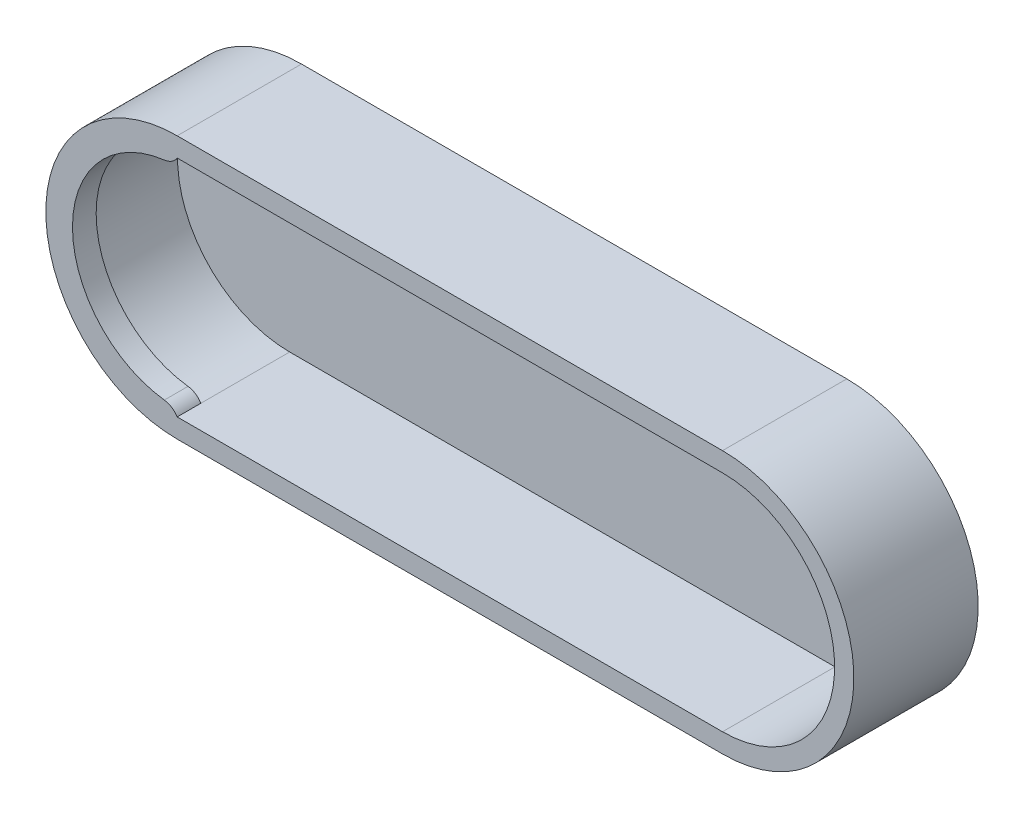
ISO-10303-21;
HEADER;
FILE_DESCRIPTION(('STEP AP214'),'2;1');
FILE_NAME('part.step','',(''),(''),'','','');
FILE_SCHEMA(('AUTOMOTIVE_DESIGN { 1 0 10303 214 1 1 1 1 }'));
ENDSEC;
DATA;
#1=APPLICATION_CONTEXT('core data for automotive mechanical design processes');
#2=APPLICATION_PROTOCOL_DEFINITION('international standard','automotive_design',2000,#1);
#3=PRODUCT_CONTEXT('',#1,'mechanical');
#4=PRODUCT('Part','Part','',(#3));
#5=PRODUCT_RELATED_PRODUCT_CATEGORY('part','',(#4));
#6=PRODUCT_DEFINITION_FORMATION('','',#4);
#7=PRODUCT_DEFINITION_CONTEXT('part definition',#1,'design');
#8=PRODUCT_DEFINITION('design','',#6,#7);
#9=PRODUCT_DEFINITION_SHAPE('','',#8);
#10=(LENGTH_UNIT() NAMED_UNIT(*) SI_UNIT(.MILLI.,.METRE.));
#11=(NAMED_UNIT(*) PLANE_ANGLE_UNIT() SI_UNIT($,.RADIAN.));
#12=(NAMED_UNIT(*) SI_UNIT($,.STERADIAN.) SOLID_ANGLE_UNIT());
#13=UNCERTAINTY_MEASURE_WITH_UNIT(LENGTH_MEASURE(1.E-05),#10,'distance_accuracy_value','');
#14=(GEOMETRIC_REPRESENTATION_CONTEXT(3) GLOBAL_UNCERTAINTY_ASSIGNED_CONTEXT((#13)) GLOBAL_UNIT_ASSIGNED_CONTEXT((#10,
#11,#12)) REPRESENTATION_CONTEXT('',''));
#15=CARTESIAN_POINT('',(0.,0.,0.));
#16=DIRECTION('',(0.,0.,1.));
#17=DIRECTION('',(1.,0.,0.));
#18=AXIS2_PLACEMENT_3D('',#15,#16,#17);
#19=CARTESIAN_POINT('',(46.06,0.,2.));
#20=DIRECTION('',(0.,0.,-1.));
#21=DIRECTION('',(-1.,0.,0.));
#22=AXIS2_PLACEMENT_3D('',#19,#20,#21);
#23=CYLINDRICAL_SURFACE('',#22,18.94);
#24=CARTESIAN_POINT('',(46.06,0.,0.));
#25=DIRECTION('',(0.,0.,-1.));
#26=DIRECTION('',(-1.,0.,0.));
#27=AXIS2_PLACEMENT_3D('',#24,#25,#26);
#28=CIRCLE('',#27,18.94);
#29=CARTESIAN_POINT('',(46.06,18.94,0.));
#30=VERTEX_POINT('',#29);
#31=CARTESIAN_POINT('',(46.06,-18.94,0.));
#32=VERTEX_POINT('',#31);
#33=EDGE_CURVE('E108',#30,#32,#28,.T.);
#34=ORIENTED_EDGE('',*,*,#33,.F.);
#35=DIRECTION('',(0.,0.,-1.));
#36=VECTOR('',#35,1.);
#37=CARTESIAN_POINT('',(46.06,18.94,2.));
#38=LINE('',#37,#36);
#39=CARTESIAN_POINT('',(46.06,18.94,2.));
#40=VERTEX_POINT('',#39);
#41=EDGE_CURVE('E12',#40,#30,#38,.T.);
#42=ORIENTED_EDGE('',*,*,#41,.F.);
#43=CARTESIAN_POINT('',(46.06,0.,2.));
#44=DIRECTION('',(0.,0.,-1.));
#45=DIRECTION('',(-1.,0.,0.));
#46=AXIS2_PLACEMENT_3D('',#43,#44,#45);
#47=CIRCLE('',#46,18.94);
#48=CARTESIAN_POINT('',(46.06,-18.94,2.));
#49=VERTEX_POINT('',#48);
#50=EDGE_CURVE('E102',#40,#49,#47,.T.);
#51=ORIENTED_EDGE('',*,*,#50,.T.);
#52=DIRECTION('',(0.,0.,-1.));
#53=VECTOR('',#52,1.);
#54=CARTESIAN_POINT('',(46.06,-18.94,2.));
#55=LINE('',#54,#53);
#56=EDGE_CURVE('E47',#49,#32,#55,.T.);
#57=ORIENTED_EDGE('',*,*,#56,.T.);
#58=EDGE_LOOP('',(#34,#42,#51,#57));
#59=FACE_BOUND('',#58,.T.);
#60=ADVANCED_FACE('F44',(#59),#23,.T.);
#61=CARTESIAN_POINT('',(46.06,18.94,2.));
#62=DIRECTION('',(0.,1.,0.));
#63=DIRECTION('',(-1.,0.,0.));
#64=AXIS2_PLACEMENT_3D('',#61,#62,#63);
#65=PLANE('',#64);
#66=DIRECTION('',(1.,0.,0.));
#67=VECTOR('',#66,1.);
#68=CARTESIAN_POINT('',(46.06,18.94,0.));
#69=LINE('',#68,#67);
#70=CARTESIAN_POINT('',(-46.06,18.94,0.));
#71=VERTEX_POINT('',#70);
#72=EDGE_CURVE('E104',#71,#30,#69,.T.);
#73=ORIENTED_EDGE('',*,*,#72,.F.);
#74=DIRECTION('',(0.,0.,-1.));
#75=VECTOR('',#74,1.);
#76=CARTESIAN_POINT('',(-46.06,18.94,2.));
#77=LINE('',#76,#75);
#78=CARTESIAN_POINT('',(-46.06,18.94,2.));
#79=VERTEX_POINT('',#78);
#80=EDGE_CURVE('E53',#79,#71,#77,.T.);
#81=ORIENTED_EDGE('',*,*,#80,.F.);
#82=DIRECTION('',(1.,0.,0.));
#83=VECTOR('',#82,1.);
#84=CARTESIAN_POINT('',(46.06,18.94,2.));
#85=LINE('',#84,#83);
#86=EDGE_CURVE('E99',#79,#40,#85,.T.);
#87=ORIENTED_EDGE('',*,*,#86,.T.);
#88=ORIENTED_EDGE('',*,*,#41,.T.);
#89=EDGE_LOOP('',(#73,#81,#87,#88));
#90=FACE_BOUND('',#89,.T.);
#91=ADVANCED_FACE('F118',(#90),#65,.T.);
#92=CARTESIAN_POINT('',(-46.06,0.,2.));
#93=DIRECTION('',(0.,0.,-1.));
#94=DIRECTION('',(-1.,0.,0.));
#95=AXIS2_PLACEMENT_3D('',#92,#93,#94);
#96=CYLINDRICAL_SURFACE('',#95,18.94);
#97=CARTESIAN_POINT('',(-46.06,0.,0.));
#98=DIRECTION('',(0.,0.,-1.));
#99=DIRECTION('',(1.,0.,0.));
#100=AXIS2_PLACEMENT_3D('',#97,#98,#99);
#101=CIRCLE('',#100,18.94);
#102=CARTESIAN_POINT('',(-46.0600000000001,-18.94,0.));
#103=VERTEX_POINT('',#102);
#104=EDGE_CURVE('E94',#103,#71,#101,.T.);
#105=ORIENTED_EDGE('',*,*,#104,.F.);
#106=DIRECTION('',(0.,0.,-1.));
#107=VECTOR('',#106,1.);
#108=CARTESIAN_POINT('',(-46.0600000000001,-18.94,2.));
#109=LINE('',#108,#107);
#110=CARTESIAN_POINT('',(-46.0600000000001,-18.94,2.));
#111=VERTEX_POINT('',#110);
#112=EDGE_CURVE('E89',#111,#103,#109,.T.);
#113=ORIENTED_EDGE('',*,*,#112,.F.);
#114=CARTESIAN_POINT('',(-46.06,0.,2.));
#115=DIRECTION('',(0.,0.,-1.));
#116=DIRECTION('',(1.,0.,0.));
#117=AXIS2_PLACEMENT_3D('',#114,#115,#116);
#118=CIRCLE('',#117,18.94);
#119=EDGE_CURVE('E92',#111,#79,#118,.T.);
#120=ORIENTED_EDGE('',*,*,#119,.T.);
#121=ORIENTED_EDGE('',*,*,#80,.T.);
#122=EDGE_LOOP('',(#105,#113,#120,#121));
#123=FACE_BOUND('',#122,.T.);
#124=ADVANCED_FACE('F91',(#123),#96,.T.);
#125=CARTESIAN_POINT('',(-46.0600000000001,-18.94,2.));
#126=DIRECTION('',(0.,-1.,0.));
#127=DIRECTION('',(1.,0.,0.));
#128=AXIS2_PLACEMENT_3D('',#125,#126,#127);
#129=PLANE('',#128);
#130=DIRECTION('',(-1.,0.,0.));
#131=VECTOR('',#130,1.);
#132=CARTESIAN_POINT('',(-46.0600000000001,-18.94,0.));
#133=LINE('',#132,#131);
#134=EDGE_CURVE('E111',#32,#103,#133,.T.);
#135=ORIENTED_EDGE('',*,*,#134,.F.);
#136=ORIENTED_EDGE('',*,*,#56,.F.);
#137=DIRECTION('',(-1.,0.,0.));
#138=VECTOR('',#137,1.);
#139=CARTESIAN_POINT('',(-46.0600000000001,-18.94,2.));
#140=LINE('',#139,#138);
#141=EDGE_CURVE('E98',#49,#111,#140,.T.);
#142=ORIENTED_EDGE('',*,*,#141,.T.);
#143=ORIENTED_EDGE('',*,*,#112,.T.);
#144=EDGE_LOOP('',(#135,#136,#142,#143));
#145=FACE_BOUND('',#144,.T.);
#146=ADVANCED_FACE('F101',(#145),#129,.T.);
#147=CARTESIAN_POINT('',(46.06,0.,2.));
#148=DIRECTION('',(0.,0.,-1.));
#149=DIRECTION('',(-1.,0.,0.));
#150=AXIS2_PLACEMENT_3D('',#147,#148,#149);
#151=PLANE('',#150);
#152=ORIENTED_EDGE('',*,*,#50,.F.);
#153=ORIENTED_EDGE('',*,*,#86,.F.);
#154=ORIENTED_EDGE('',*,*,#119,.F.);
#155=ORIENTED_EDGE('',*,*,#141,.F.);
#156=EDGE_LOOP('',(#152,#153,#154,#155));
#157=FACE_BOUND('',#156,.T.);
#158=ADVANCED_FACE('F97',(#157),#151,.F.);
#159=CARTESIAN_POINT('',(46.06,0.,0.));
#160=DIRECTION('',(0.,0.,-1.));
#161=DIRECTION('',(-1.,0.,0.));
#162=AXIS2_PLACEMENT_3D('',#159,#160,#161);
#163=PLANE('',#162);
#164=ORIENTED_EDGE('',*,*,#33,.T.);
#165=ORIENTED_EDGE('',*,*,#134,.T.);
#166=ORIENTED_EDGE('',*,*,#104,.T.);
#167=ORIENTED_EDGE('',*,*,#72,.T.);
#168=EDGE_LOOP('',(#164,#165,#166,#167));
#169=FACE_BOUND('',#168,.T.);
#170=ADVANCED_FACE('F117',(#169),#163,.T.);
#171=CLOSED_SHELL('',(#60,#91,#124,#146,#158,#170));
#172=MANIFOLD_SOLID_BREP('B2',#171);
#173=CARTESIAN_POINT('',(-46.06,0.,21.));
#174=DIRECTION('',(0.,0.,-1.));
#175=DIRECTION('',(-1.,0.,0.));
#176=AXIS2_PLACEMENT_3D('',#173,#174,#175);
#177=CYLINDRICAL_SURFACE('',#176,18.94);
#178=DIRECTION('',(0.,0.,-1.));
#179=VECTOR('',#178,1.);
#180=CARTESIAN_POINT('',(-46.06,18.94,21.));
#181=LINE('',#180,#179);
#182=CARTESIAN_POINT('',(-46.06,18.94,17.));
#183=VERTEX_POINT('',#182);
#184=CARTESIAN_POINT('',(-46.06,18.94,0.));
#185=VERTEX_POINT('',#184);
#186=EDGE_CURVE('E271',#183,#185,#181,.T.);
#187=ORIENTED_EDGE('',*,*,#186,.F.);
#188=CARTESIAN_POINT('',(-46.06,0.,17.));
#189=DIRECTION('',(0.,0.,1.));
#190=DIRECTION('',(1.,0.,0.));
#191=AXIS2_PLACEMENT_3D('',#188,#189,#190);
#192=CIRCLE('',#191,18.94);
#193=CARTESIAN_POINT('',(-46.0599999999998,-18.94,17.));
#194=VERTEX_POINT('',#193);
#195=EDGE_CURVE('E251',#183,#194,#192,.T.);
#196=ORIENTED_EDGE('',*,*,#195,.T.);
#197=DIRECTION('',(0.,0.,-1.));
#198=VECTOR('',#197,1.);
#199=CARTESIAN_POINT('',(-46.0600000000001,-18.94,21.));
#200=LINE('',#199,#198);
#201=CARTESIAN_POINT('',(-46.0600000000001,-18.94,0.));
#202=VERTEX_POINT('',#201);
#203=EDGE_CURVE('E259',#194,#202,#200,.T.);
#204=ORIENTED_EDGE('',*,*,#203,.T.);
#205=CARTESIAN_POINT('',(-46.06,0.,0.));
#206=DIRECTION('',(0.,0.,1.));
#207=DIRECTION('',(1.,0.,0.));
#208=AXIS2_PLACEMENT_3D('',#205,#206,#207);
#209=CIRCLE('',#208,18.94);
#210=EDGE_CURVE('E348',#185,#202,#209,.T.);
#211=ORIENTED_EDGE('',*,*,#210,.F.);
#212=EDGE_LOOP('',(#187,#196,#204,#211));
#213=FACE_BOUND('',#212,.T.);
#214=ADVANCED_FACE('F167',(#213),#177,.F.);
#215=CARTESIAN_POINT('',(-46.06,0.,21.));
#216=DIRECTION('',(0.,0.,1.));
#217=DIRECTION('',(1.,0.,0.));
#218=AXIS2_PLACEMENT_3D('',#215,#216,#217);
#219=PLANE('',#218);
#220=CARTESIAN_POINT('',(-46.06,0.,21.));
#221=DIRECTION('',(0.,0.,1.));
#222=DIRECTION('',(1.,0.,0.));
#223=AXIS2_PLACEMENT_3D('',#220,#221,#222);
#224=CIRCLE('',#223,22.19);
#225=CARTESIAN_POINT('',(-46.06,22.19,21.));
#226=VERTEX_POINT('',#225);
#227=CARTESIAN_POINT('',(-46.06,-22.19,21.));
#228=VERTEX_POINT('',#227);
#229=EDGE_CURVE('E285',#226,#228,#224,.T.);
#230=ORIENTED_EDGE('',*,*,#229,.T.);
#231=DIRECTION('',(1.,0.,0.));
#232=VECTOR('',#231,1.);
#233=CARTESIAN_POINT('',(-46.06,-22.19,21.));
#234=LINE('',#233,#232);
#235=CARTESIAN_POINT('',(46.0600000000001,-22.19,21.));
#236=VERTEX_POINT('',#235);
#237=EDGE_CURVE('E288',#228,#236,#234,.T.);
#238=ORIENTED_EDGE('',*,*,#237,.T.);
#239=CARTESIAN_POINT('',(46.06,0.,21.));
#240=DIRECTION('',(0.,0.,1.));
#241=DIRECTION('',(-1.,0.,0.));
#242=AXIS2_PLACEMENT_3D('',#239,#240,#241);
#243=CIRCLE('',#242,22.19);
#244=CARTESIAN_POINT('',(46.06,22.19,21.));
#245=VERTEX_POINT('',#244);
#246=EDGE_CURVE('E291',#236,#245,#243,.T.);
#247=ORIENTED_EDGE('',*,*,#246,.T.);
#248=DIRECTION('',(-1.,0.,0.));
#249=VECTOR('',#248,1.);
#250=CARTESIAN_POINT('',(-46.06,22.19,21.));
#251=LINE('',#250,#249);
#252=EDGE_CURVE('E293',#245,#226,#251,.T.);
#253=ORIENTED_EDGE('',*,*,#252,.T.);
#254=EDGE_LOOP('',(#230,#238,#247,#253));
#255=FACE_BOUND('',#254,.T.);
#256=CARTESIAN_POINT('',(-46.06,0.,21.));
#257=DIRECTION('',(0.,0.,-1.));
#258=DIRECTION('',(1.,0.,0.));
#259=AXIS2_PLACEMENT_3D('',#256,#257,#258);
#260=CIRCLE('',#259,17.69);
#261=CARTESIAN_POINT('',(-48.2333782115873,-17.5559826597487,21.));
#262=VERTEX_POINT('',#261);
#263=CARTESIAN_POINT('',(-48.2333782115875,17.5559826597487,21.));
#264=VERTEX_POINT('',#263);
#265=EDGE_CURVE('E273',#262,#264,#260,.T.);
#266=ORIENTED_EDGE('',*,*,#265,.T.);
#267=CARTESIAN_POINT('',(-48.6019556358251,20.5332550158395,21.));
#268=DIRECTION('',(0.,0.,1.));
#269=DIRECTION('',(1.,0.,0.));
#270=AXIS2_PLACEMENT_3D('',#267,#268,#269);
#271=CIRCLE('',#270,3.);
#272=CARTESIAN_POINT('',(-46.06,18.94,21.));
#273=VERTEX_POINT('',#272);
#274=EDGE_CURVE('E255',#264,#273,#271,.T.);
#275=ORIENTED_EDGE('',*,*,#274,.T.);
#276=DIRECTION('',(-1.,0.,0.));
#277=VECTOR('',#276,1.);
#278=CARTESIAN_POINT('',(-46.06,18.94,21.));
#279=LINE('',#278,#277);
#280=CARTESIAN_POINT('',(46.06,18.94,21.));
#281=VERTEX_POINT('',#280);
#282=EDGE_CURVE('E325',#281,#273,#279,.T.);
#283=ORIENTED_EDGE('',*,*,#282,.F.);
#284=CARTESIAN_POINT('',(46.06,0.,21.));
#285=DIRECTION('',(0.,0.,1.));
#286=DIRECTION('',(-1.,0.,0.));
#287=AXIS2_PLACEMENT_3D('',#284,#285,#286);
#288=CIRCLE('',#287,18.94);
#289=CARTESIAN_POINT('',(46.06,-18.94,21.));
#290=VERTEX_POINT('',#289);
#291=EDGE_CURVE('E333',#290,#281,#288,.T.);
#292=ORIENTED_EDGE('',*,*,#291,.F.);
#293=DIRECTION('',(1.,0.,0.));
#294=VECTOR('',#293,1.);
#295=CARTESIAN_POINT('',(-46.06,-18.94,21.));
#296=LINE('',#295,#294);
#297=CARTESIAN_POINT('',(-46.0600000000001,-18.94,21.));
#298=VERTEX_POINT('',#297);
#299=EDGE_CURVE('E332',#298,#290,#296,.T.);
#300=ORIENTED_EDGE('',*,*,#299,.F.);
#301=CARTESIAN_POINT('',(-48.6019556358248,-20.5332550158395,21.));
#302=DIRECTION('',(0.,0.,1.));
#303=DIRECTION('',(1.,0.,0.));
#304=AXIS2_PLACEMENT_3D('',#301,#302,#303);
#305=CIRCLE('',#304,3.);
#306=EDGE_CURVE('E275',#298,#262,#305,.T.);
#307=ORIENTED_EDGE('',*,*,#306,.T.);
#308=EDGE_LOOP('',(#266,#275,#283,#292,#300,#307));
#309=FACE_BOUND('',#308,.T.);
#310=ADVANCED_FACE('F323',(#255,#309),#219,.T.);
#311=CARTESIAN_POINT('',(-46.06,0.,0.));
#312=DIRECTION('',(0.,0.,1.));
#313=DIRECTION('',(1.,0.,0.));
#314=AXIS2_PLACEMENT_3D('',#311,#312,#313);
#315=PLANE('',#314);
#316=CARTESIAN_POINT('',(-46.06,0.,0.));
#317=DIRECTION('',(0.,0.,1.));
#318=DIRECTION('',(1.,0.,0.));
#319=AXIS2_PLACEMENT_3D('',#316,#317,#318);
#320=CIRCLE('',#319,22.19);
#321=CARTESIAN_POINT('',(-46.06,22.19,0.));
#322=VERTEX_POINT('',#321);
#323=CARTESIAN_POINT('',(-46.06,-22.19,0.));
#324=VERTEX_POINT('',#323);
#325=EDGE_CURVE('E284',#322,#324,#320,.T.);
#326=ORIENTED_EDGE('',*,*,#325,.F.);
#327=DIRECTION('',(-1.,0.,0.));
#328=VECTOR('',#327,1.);
#329=CARTESIAN_POINT('',(-46.06,22.19,0.));
#330=LINE('',#329,#328);
#331=CARTESIAN_POINT('',(46.06,22.19,0.));
#332=VERTEX_POINT('',#331);
#333=EDGE_CURVE('E289',#332,#322,#330,.T.);
#334=ORIENTED_EDGE('',*,*,#333,.F.);
#335=CARTESIAN_POINT('',(46.06,0.,0.));
#336=DIRECTION('',(0.,0.,1.));
#337=DIRECTION('',(-1.,0.,0.));
#338=AXIS2_PLACEMENT_3D('',#335,#336,#337);
#339=CIRCLE('',#338,22.19);
#340=CARTESIAN_POINT('',(46.0600000000001,-22.19,0.));
#341=VERTEX_POINT('',#340);
#342=EDGE_CURVE('E300',#341,#332,#339,.T.);
#343=ORIENTED_EDGE('',*,*,#342,.F.);
#344=DIRECTION('',(1.,0.,0.));
#345=VECTOR('',#344,1.);
#346=CARTESIAN_POINT('',(-46.06,-22.19,0.));
#347=LINE('',#346,#345);
#348=EDGE_CURVE('E298',#324,#341,#347,.T.);
#349=ORIENTED_EDGE('',*,*,#348,.F.);
#350=EDGE_LOOP('',(#326,#334,#343,#349));
#351=FACE_BOUND('',#350,.T.);
#352=CARTESIAN_POINT('',(46.06,0.,0.));
#353=DIRECTION('',(0.,0.,1.));
#354=DIRECTION('',(-1.,0.,0.));
#355=AXIS2_PLACEMENT_3D('',#352,#353,#354);
#356=CIRCLE('',#355,18.94);
#357=CARTESIAN_POINT('',(46.06,-18.94,0.));
#358=VERTEX_POINT('',#357);
#359=CARTESIAN_POINT('',(46.06,18.94,0.));
#360=VERTEX_POINT('',#359);
#361=EDGE_CURVE('E337',#358,#360,#356,.T.);
#362=ORIENTED_EDGE('',*,*,#361,.T.);
#363=DIRECTION('',(-1.,0.,0.));
#364=VECTOR('',#363,1.);
#365=CARTESIAN_POINT('',(-46.06,18.94,0.));
#366=LINE('',#365,#364);
#367=EDGE_CURVE('E340',#360,#185,#366,.T.);
#368=ORIENTED_EDGE('',*,*,#367,.T.);
#369=ORIENTED_EDGE('',*,*,#210,.T.);
#370=DIRECTION('',(1.,0.,0.));
#371=VECTOR('',#370,1.);
#372=CARTESIAN_POINT('',(-46.06,-18.94,0.));
#373=LINE('',#372,#371);
#374=EDGE_CURVE('E265',#202,#358,#373,.T.);
#375=ORIENTED_EDGE('',*,*,#374,.T.);
#376=EDGE_LOOP('',(#362,#368,#369,#375));
#377=FACE_BOUND('',#376,.T.);
#378=ADVANCED_FACE('F350',(#351,#377),#315,.F.);
#379=CARTESIAN_POINT('',(-46.06,0.,21.));
#380=DIRECTION('',(0.,0.,-1.));
#381=DIRECTION('',(-1.,0.,0.));
#382=AXIS2_PLACEMENT_3D('',#379,#380,#381);
#383=CYLINDRICAL_SURFACE('',#382,22.19);
#384=ORIENTED_EDGE('',*,*,#325,.T.);
#385=DIRECTION('',(0.,0.,-1.));
#386=VECTOR('',#385,1.);
#387=CARTESIAN_POINT('',(-46.06,-22.19,21.));
#388=LINE('',#387,#386);
#389=EDGE_CURVE('E311',#228,#324,#388,.T.);
#390=ORIENTED_EDGE('',*,*,#389,.F.);
#391=ORIENTED_EDGE('',*,*,#229,.F.);
#392=DIRECTION('',(0.,0.,-1.));
#393=VECTOR('',#392,1.);
#394=CARTESIAN_POINT('',(-46.06,22.19,21.));
#395=LINE('',#394,#393);
#396=EDGE_CURVE('E295',#226,#322,#395,.T.);
#397=ORIENTED_EDGE('',*,*,#396,.T.);
#398=EDGE_LOOP('',(#384,#390,#391,#397));
#399=FACE_BOUND('',#398,.T.);
#400=ADVANCED_FACE('F386',(#399),#383,.T.);
#401=CARTESIAN_POINT('',(-46.06,-22.19,21.));
#402=DIRECTION('',(0.,1.,0.));
#403=DIRECTION('',(-1.,0.,0.));
#404=AXIS2_PLACEMENT_3D('',#401,#402,#403);
#405=PLANE('',#404);
#406=ORIENTED_EDGE('',*,*,#348,.T.);
#407=DIRECTION('',(0.,0.,-1.));
#408=VECTOR('',#407,1.);
#409=CARTESIAN_POINT('',(46.0600000000001,-22.19,21.));
#410=LINE('',#409,#408);
#411=EDGE_CURVE('E308',#236,#341,#410,.T.);
#412=ORIENTED_EDGE('',*,*,#411,.F.);
#413=ORIENTED_EDGE('',*,*,#237,.F.);
#414=ORIENTED_EDGE('',*,*,#389,.T.);
#415=EDGE_LOOP('',(#406,#412,#413,#414));
#416=FACE_BOUND('',#415,.T.);
#417=ADVANCED_FACE('F389',(#416),#405,.F.);
#418=CARTESIAN_POINT('',(46.06,0.,21.));
#419=DIRECTION('',(0.,0.,-1.));
#420=DIRECTION('',(-1.,0.,0.));
#421=AXIS2_PLACEMENT_3D('',#418,#419,#420);
#422=CYLINDRICAL_SURFACE('',#421,22.19);
#423=ORIENTED_EDGE('',*,*,#342,.T.);
#424=DIRECTION('',(0.,0.,-1.));
#425=VECTOR('',#424,1.);
#426=CARTESIAN_POINT('',(46.06,22.19,21.));
#427=LINE('',#426,#425);
#428=EDGE_CURVE('E305',#245,#332,#427,.T.);
#429=ORIENTED_EDGE('',*,*,#428,.F.);
#430=ORIENTED_EDGE('',*,*,#246,.F.);
#431=ORIENTED_EDGE('',*,*,#411,.T.);
#432=EDGE_LOOP('',(#423,#429,#430,#431));
#433=FACE_BOUND('',#432,.T.);
#434=ADVANCED_FACE('F363',(#433),#422,.T.);
#435=CARTESIAN_POINT('',(-46.06,22.19,21.));
#436=DIRECTION('',(0.,-1.,0.));
#437=DIRECTION('',(0.,0.,-1.));
#438=AXIS2_PLACEMENT_3D('',#435,#436,#437);
#439=PLANE('',#438);
#440=ORIENTED_EDGE('',*,*,#333,.T.);
#441=ORIENTED_EDGE('',*,*,#396,.F.);
#442=ORIENTED_EDGE('',*,*,#252,.F.);
#443=ORIENTED_EDGE('',*,*,#428,.T.);
#444=EDGE_LOOP('',(#440,#441,#442,#443));
#445=FACE_BOUND('',#444,.T.);
#446=ADVANCED_FACE('F355',(#445),#439,.F.);
#447=CARTESIAN_POINT('',(46.06,0.,21.));
#448=DIRECTION('',(0.,0.,-1.));
#449=DIRECTION('',(-1.,0.,0.));
#450=AXIS2_PLACEMENT_3D('',#447,#448,#449);
#451=CYLINDRICAL_SURFACE('',#450,18.94);
#452=ORIENTED_EDGE('',*,*,#361,.F.);
#453=DIRECTION('',(0.,0.,-1.));
#454=VECTOR('',#453,1.);
#455=CARTESIAN_POINT('',(46.06,-18.94,21.));
#456=LINE('',#455,#454);
#457=EDGE_CURVE('E269',#290,#358,#456,.T.);
#458=ORIENTED_EDGE('',*,*,#457,.F.);
#459=ORIENTED_EDGE('',*,*,#291,.T.);
#460=DIRECTION('',(0.,0.,-1.));
#461=VECTOR('',#460,1.);
#462=CARTESIAN_POINT('',(46.06,18.94,21.));
#463=LINE('',#462,#461);
#464=EDGE_CURVE('E281',#281,#360,#463,.T.);
#465=ORIENTED_EDGE('',*,*,#464,.T.);
#466=EDGE_LOOP('',(#452,#458,#459,#465));
#467=FACE_BOUND('',#466,.T.);
#468=ADVANCED_FACE('F352',(#467),#451,.F.);
#469=CARTESIAN_POINT('',(-46.06,18.94,21.));
#470=DIRECTION('',(0.,-1.,0.));
#471=DIRECTION('',(1.,0.,0.));
#472=AXIS2_PLACEMENT_3D('',#469,#470,#471);
#473=PLANE('',#472);
#474=ORIENTED_EDGE('',*,*,#367,.F.);
#475=ORIENTED_EDGE('',*,*,#464,.F.);
#476=ORIENTED_EDGE('',*,*,#282,.T.);
#477=EDGE_CURVE('E276',#273,#183,#181,.T.);
#478=ORIENTED_EDGE('',*,*,#477,.T.);
#479=ORIENTED_EDGE('',*,*,#186,.T.);
#480=EDGE_LOOP('',(#474,#475,#476,#478,#479));
#481=FACE_BOUND('',#480,.T.);
#482=ADVANCED_FACE('F331',(#481),#473,.T.);
#483=CARTESIAN_POINT('',(-46.06,-18.94,21.));
#484=DIRECTION('',(0.,1.,0.));
#485=DIRECTION('',(-1.,0.,0.));
#486=AXIS2_PLACEMENT_3D('',#483,#484,#485);
#487=PLANE('',#486);
#488=ORIENTED_EDGE('',*,*,#374,.F.);
#489=ORIENTED_EDGE('',*,*,#203,.F.);
#490=EDGE_CURVE('E261',#298,#194,#200,.T.);
#491=ORIENTED_EDGE('',*,*,#490,.F.);
#492=ORIENTED_EDGE('',*,*,#299,.T.);
#493=ORIENTED_EDGE('',*,*,#457,.T.);
#494=EDGE_LOOP('',(#488,#489,#491,#492,#493));
#495=FACE_BOUND('',#494,.T.);
#496=ADVANCED_FACE('F260',(#495),#487,.T.);
#497=CARTESIAN_POINT('',(-46.06,0.,17.));
#498=DIRECTION('',(0.,0.,1.));
#499=DIRECTION('',(1.,0.,0.));
#500=AXIS2_PLACEMENT_3D('',#497,#498,#499);
#501=CYLINDRICAL_SURFACE('',#500,17.69);
#502=CARTESIAN_POINT('',(-46.06,0.,17.));
#503=DIRECTION('',(0.,0.,-1.));
#504=DIRECTION('',(1.,0.,0.));
#505=AXIS2_PLACEMENT_3D('',#502,#503,#504);
#506=CIRCLE('',#505,17.69);
#507=CARTESIAN_POINT('',(-48.2333782115873,-17.5559826597487,17.));
#508=VERTEX_POINT('',#507);
#509=CARTESIAN_POINT('',(-48.2333782115875,17.5559826597487,17.));
#510=VERTEX_POINT('',#509);
#511=EDGE_CURVE('E252',#508,#510,#506,.T.);
#512=ORIENTED_EDGE('',*,*,#511,.T.);
#513=DIRECTION('',(0.,0.,1.));
#514=VECTOR('',#513,1.);
#515=CARTESIAN_POINT('',(-48.2333782115875,17.5559826597487,17.));
#516=LINE('',#515,#514);
#517=EDGE_CURVE('E315',#510,#264,#516,.T.);
#518=ORIENTED_EDGE('',*,*,#517,.T.);
#519=ORIENTED_EDGE('',*,*,#265,.F.);
#520=DIRECTION('',(0.,0.,1.));
#521=VECTOR('',#520,1.);
#522=CARTESIAN_POINT('',(-48.2333782115873,-17.5559826597487,17.));
#523=LINE('',#522,#521);
#524=EDGE_CURVE('E187',#262,#508,#523,.F.);
#525=ORIENTED_EDGE('',*,*,#524,.T.);
#526=EDGE_LOOP('',(#512,#518,#519,#525));
#527=FACE_BOUND('',#526,.T.);
#528=ADVANCED_FACE('F336',(#527),#501,.F.);
#529=CARTESIAN_POINT('',(-46.06,0.,17.));
#530=DIRECTION('',(0.,0.,1.));
#531=DIRECTION('',(1.,0.,0.));
#532=AXIS2_PLACEMENT_3D('',#529,#530,#531);
#533=PLANE('',#532);
#534=ORIENTED_EDGE('',*,*,#195,.F.);
#535=CARTESIAN_POINT('',(-48.6019556358251,20.5332550158395,17.));
#536=DIRECTION('',(0.,0.,1.));
#537=DIRECTION('',(1.,0.,0.));
#538=AXIS2_PLACEMENT_3D('',#535,#536,#537);
#539=CIRCLE('',#538,3.);
#540=EDGE_CURVE('E42',#183,#510,#539,.F.);
#541=ORIENTED_EDGE('',*,*,#540,.T.);
#542=ORIENTED_EDGE('',*,*,#511,.F.);
#543=CARTESIAN_POINT('',(-48.6019556358248,-20.5332550158395,17.));
#544=DIRECTION('',(0.,0.,1.));
#545=DIRECTION('',(1.,0.,0.));
#546=AXIS2_PLACEMENT_3D('',#543,#544,#545);
#547=CIRCLE('',#546,3.);
#548=EDGE_CURVE('E175',#508,#194,#547,.F.);
#549=ORIENTED_EDGE('',*,*,#548,.T.);
#550=EDGE_LOOP('',(#534,#541,#542,#549));
#551=FACE_BOUND('',#550,.T.);
#552=ADVANCED_FACE('F249',(#551),#533,.F.);
#553=CARTESIAN_POINT('',(-48.6019556358251,20.5332550158395,17.));
#554=DIRECTION('',(0.,0.,1.));
#555=DIRECTION('',(1.,0.,0.));
#556=AXIS2_PLACEMENT_3D('',#553,#554,#555);
#557=CYLINDRICAL_SURFACE('',#556,3.);
#558=ORIENTED_EDGE('',*,*,#540,.F.);
#559=ORIENTED_EDGE('',*,*,#477,.F.);
#560=ORIENTED_EDGE('',*,*,#274,.F.);
#561=ORIENTED_EDGE('',*,*,#517,.F.);
#562=EDGE_LOOP('',(#558,#559,#560,#561));
#563=FACE_BOUND('',#562,.T.);
#564=ADVANCED_FACE('F335',(#563),#557,.T.);
#565=CARTESIAN_POINT('',(-48.6019556358248,-20.5332550158395,17.));
#566=DIRECTION('',(0.,0.,1.));
#567=DIRECTION('',(1.,0.,0.));
#568=AXIS2_PLACEMENT_3D('',#565,#566,#567);
#569=CYLINDRICAL_SURFACE('',#568,3.);
#570=ORIENTED_EDGE('',*,*,#548,.F.);
#571=ORIENTED_EDGE('',*,*,#524,.F.);
#572=ORIENTED_EDGE('',*,*,#306,.F.);
#573=ORIENTED_EDGE('',*,*,#490,.T.);
#574=EDGE_LOOP('',(#570,#571,#572,#573));
#575=FACE_BOUND('',#574,.T.);
#576=ADVANCED_FACE('F169',(#575),#569,.T.);
#577=CLOSED_SHELL('',(#214,#310,#378,#400,#417,#434,#446,#468,#482,#496,#528,#552,#564,#576));
#578=MANIFOLD_SOLID_BREP('B6',#577);
#579=ADVANCED_BREP_SHAPE_REPRESENTATION('',(#18,#172,#578),#14);
#580=SHAPE_DEFINITION_REPRESENTATION(#9,#579);
ENDSEC;
END-ISO-10303-21;
